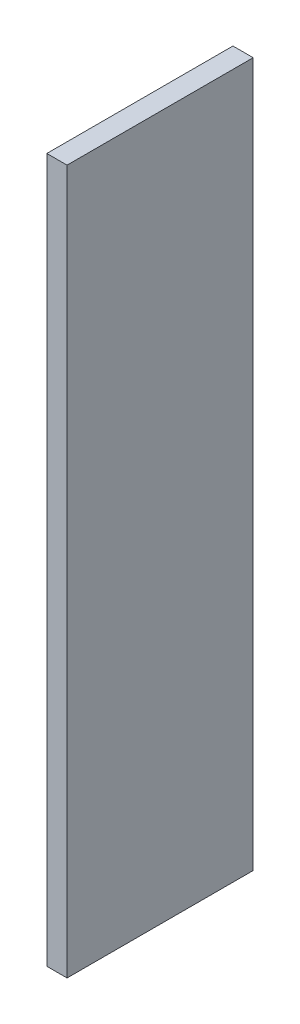
ISO-10303-21;
HEADER;
FILE_DESCRIPTION(('STEP AP214'),'2;1');
FILE_NAME('part.step','',(''),(''),'','','');
FILE_SCHEMA(('AUTOMOTIVE_DESIGN { 1 0 10303 214 1 1 1 1 }'));
ENDSEC;
DATA;
#1=APPLICATION_CONTEXT('core data for automotive mechanical design processes');
#2=APPLICATION_PROTOCOL_DEFINITION('international standard','automotive_design',2000,#1);
#3=PRODUCT_CONTEXT('',#1,'mechanical');
#4=PRODUCT('Part','Part','',(#3));
#5=PRODUCT_RELATED_PRODUCT_CATEGORY('part','',(#4));
#6=PRODUCT_DEFINITION_FORMATION('','',#4);
#7=PRODUCT_DEFINITION_CONTEXT('part definition',#1,'design');
#8=PRODUCT_DEFINITION('design','',#6,#7);
#9=PRODUCT_DEFINITION_SHAPE('','',#8);
#10=(LENGTH_UNIT() NAMED_UNIT(*) SI_UNIT(.MILLI.,.METRE.));
#11=(NAMED_UNIT(*) PLANE_ANGLE_UNIT() SI_UNIT($,.RADIAN.));
#12=(NAMED_UNIT(*) SI_UNIT($,.STERADIAN.) SOLID_ANGLE_UNIT());
#13=UNCERTAINTY_MEASURE_WITH_UNIT(LENGTH_MEASURE(1.E-05),#10,'distance_accuracy_value','');
#14=(GEOMETRIC_REPRESENTATION_CONTEXT(3) GLOBAL_UNCERTAINTY_ASSIGNED_CONTEXT((#13)) GLOBAL_UNIT_ASSIGNED_CONTEXT((#10,
#11,#12)) REPRESENTATION_CONTEXT('',''));
#15=CARTESIAN_POINT('',(0.,0.,0.));
#16=DIRECTION('',(0.,0.,1.));
#17=DIRECTION('',(1.,0.,0.));
#18=AXIS2_PLACEMENT_3D('',#15,#16,#17);
#19=CARTESIAN_POINT('',(1.17,0.832,-0.22));
#20=DIRECTION('',(0.,0.,1.));
#21=DIRECTION('',(0.,-1.,0.));
#22=AXIS2_PLACEMENT_3D('',#19,#20,#21);
#23=PLANE('',#22);
#24=DIRECTION('',(0.,-1.,0.));
#25=VECTOR('',#24,1.);
#26=CARTESIAN_POINT('',(1.22,0.,-0.22));
#27=LINE('',#26,#25);
#28=CARTESIAN_POINT('',(1.22,0.87,-0.22));
#29=VERTEX_POINT('',#28);
#30=CARTESIAN_POINT('',(1.22,-0.87,-0.22));
#31=VERTEX_POINT('',#30);
#32=EDGE_CURVE('E37',#29,#31,#27,.T.);
#33=ORIENTED_EDGE('',*,*,#32,.T.);
#34=DIRECTION('',(1.,0.,0.));
#35=VECTOR('',#34,1.);
#36=CARTESIAN_POINT('',(0.03,-0.87,-0.22));
#37=LINE('',#36,#35);
#38=CARTESIAN_POINT('',(1.17,-0.87,-0.22));
#39=VERTEX_POINT('',#38);
#40=EDGE_CURVE('E83',#39,#31,#37,.T.);
#41=ORIENTED_EDGE('',*,*,#40,.F.);
#42=DIRECTION('',(0.,-1.,0.));
#43=VECTOR('',#42,1.);
#44=CARTESIAN_POINT('',(1.17,0.832,-0.22));
#45=LINE('',#44,#43);
#46=CARTESIAN_POINT('',(1.17,0.87,-0.22));
#47=VERTEX_POINT('',#46);
#48=EDGE_CURVE('E11',#47,#39,#45,.T.);
#49=ORIENTED_EDGE('',*,*,#48,.F.);
#50=DIRECTION('',(-1.,0.,0.));
#51=VECTOR('',#50,1.);
#52=CARTESIAN_POINT('',(0.03,0.87,-0.22));
#53=LINE('',#52,#51);
#54=EDGE_CURVE('E85',#29,#47,#53,.T.);
#55=ORIENTED_EDGE('',*,*,#54,.F.);
#56=EDGE_LOOP('',(#33,#41,#49,#55));
#57=FACE_BOUND('',#56,.T.);
#58=ADVANCED_FACE('F33',(#57),#23,.F.);
#59=CARTESIAN_POINT('',(1.17,0.546,0.24));
#60=DIRECTION('',(-1.,0.,0.));
#61=DIRECTION('',(0.,0.,1.));
#62=AXIS2_PLACEMENT_3D('',#59,#60,#61);
#63=PLANE('',#62);
#64=DIRECTION('',(0.,1.,0.));
#65=VECTOR('',#64,1.);
#66=CARTESIAN_POINT('',(1.17,-0.746,0.24));
#67=LINE('',#66,#65);
#68=CARTESIAN_POINT('',(1.17,-0.87,0.24));
#69=VERTEX_POINT('',#68);
#70=CARTESIAN_POINT('',(1.17,0.87,0.24));
#71=VERTEX_POINT('',#70);
#72=EDGE_CURVE('E42',#69,#71,#67,.T.);
#73=ORIENTED_EDGE('',*,*,#72,.T.);
#74=DIRECTION('',(0.,0.,-1.));
#75=VECTOR('',#74,1.);
#76=CARTESIAN_POINT('',(1.17,0.87,0.22));
#77=LINE('',#76,#75);
#78=EDGE_CURVE('E79',#71,#47,#77,.T.);
#79=ORIENTED_EDGE('',*,*,#78,.T.);
#80=ORIENTED_EDGE('',*,*,#48,.T.);
#81=DIRECTION('',(0.,0.,-1.));
#82=VECTOR('',#81,1.);
#83=CARTESIAN_POINT('',(1.17,-0.87,1.41968162443208));
#84=LINE('',#83,#82);
#85=EDGE_CURVE('E77',#69,#39,#84,.T.);
#86=ORIENTED_EDGE('',*,*,#85,.F.);
#87=EDGE_LOOP('',(#73,#79,#80,#86));
#88=FACE_BOUND('',#87,.T.);
#89=ADVANCED_FACE('F75',(#88),#63,.T.);
#90=CARTESIAN_POINT('',(1.22,0.,0.));
#91=DIRECTION('',(1.,0.,0.));
#92=DIRECTION('',(0.,0.,-1.));
#93=AXIS2_PLACEMENT_3D('',#90,#91,#92);
#94=PLANE('',#93);
#95=ORIENTED_EDGE('',*,*,#32,.F.);
#96=DIRECTION('',(0.,0.,1.));
#97=VECTOR('',#96,1.);
#98=CARTESIAN_POINT('',(1.22,0.87,-0.22));
#99=LINE('',#98,#97);
#100=CARTESIAN_POINT('',(1.22,0.87,0.24));
#101=VERTEX_POINT('',#100);
#102=EDGE_CURVE('E90',#29,#101,#99,.T.);
#103=ORIENTED_EDGE('',*,*,#102,.T.);
#104=DIRECTION('',(0.,1.,0.));
#105=VECTOR('',#104,1.);
#106=CARTESIAN_POINT('',(1.22,-0.87,0.24));
#107=LINE('',#106,#105);
#108=CARTESIAN_POINT('',(1.22,-0.87,0.24));
#109=VERTEX_POINT('',#108);
#110=EDGE_CURVE('E92',#109,#101,#107,.T.);
#111=ORIENTED_EDGE('',*,*,#110,.F.);
#112=DIRECTION('',(0.,0.,-1.));
#113=VECTOR('',#112,1.);
#114=CARTESIAN_POINT('',(1.22,-0.87,0.22));
#115=LINE('',#114,#113);
#116=EDGE_CURVE('E57',#109,#31,#115,.T.);
#117=ORIENTED_EDGE('',*,*,#116,.T.);
#118=EDGE_LOOP('',(#95,#103,#111,#117));
#119=FACE_BOUND('',#118,.T.);
#120=ADVANCED_FACE('F106',(#119),#94,.T.);
#121=CARTESIAN_POINT('',(0.03,-0.87,0.22));
#122=DIRECTION('',(0.,1.,0.));
#123=DIRECTION('',(0.,0.,1.));
#124=AXIS2_PLACEMENT_3D('',#121,#122,#123);
#125=PLANE('',#124);
#126=ORIENTED_EDGE('',*,*,#85,.T.);
#127=ORIENTED_EDGE('',*,*,#40,.T.);
#128=ORIENTED_EDGE('',*,*,#116,.F.);
#129=DIRECTION('',(1.,0.,0.));
#130=VECTOR('',#129,1.);
#131=CARTESIAN_POINT('',(1.17,-0.87,0.24));
#132=LINE('',#131,#130);
#133=EDGE_CURVE('E88',#69,#109,#132,.T.);
#134=ORIENTED_EDGE('',*,*,#133,.F.);
#135=EDGE_LOOP('',(#126,#127,#128,#134));
#136=FACE_BOUND('',#135,.T.);
#137=ADVANCED_FACE('F87',(#136),#125,.F.);
#138=CARTESIAN_POINT('',(0.03,0.87,0.22));
#139=DIRECTION('',(0.,-1.,0.));
#140=DIRECTION('',(0.,0.,-1.));
#141=AXIS2_PLACEMENT_3D('',#138,#139,#140);
#142=PLANE('',#141);
#143=ORIENTED_EDGE('',*,*,#102,.F.);
#144=ORIENTED_EDGE('',*,*,#54,.T.);
#145=ORIENTED_EDGE('',*,*,#78,.F.);
#146=DIRECTION('',(-1.,0.,0.));
#147=VECTOR('',#146,1.);
#148=CARTESIAN_POINT('',(1.22,0.87,0.24));
#149=LINE('',#148,#147);
#150=EDGE_CURVE('E89',#101,#71,#149,.T.);
#151=ORIENTED_EDGE('',*,*,#150,.F.);
#152=EDGE_LOOP('',(#143,#144,#145,#151));
#153=FACE_BOUND('',#152,.T.);
#154=ADVANCED_FACE('F103',(#153),#142,.F.);
#155=CARTESIAN_POINT('',(0.,0.,0.24));
#156=DIRECTION('',(0.,0.,1.));
#157=DIRECTION('',(1.,0.,0.));
#158=AXIS2_PLACEMENT_3D('',#155,#156,#157);
#159=PLANE('',#158);
#160=ORIENTED_EDGE('',*,*,#150,.T.);
#161=ORIENTED_EDGE('',*,*,#72,.F.);
#162=ORIENTED_EDGE('',*,*,#133,.T.);
#163=ORIENTED_EDGE('',*,*,#110,.T.);
#164=EDGE_LOOP('',(#160,#161,#162,#163));
#165=FACE_BOUND('',#164,.T.);
#166=ADVANCED_FACE('F35',(#165),#159,.T.);
#167=CLOSED_SHELL('',(#58,#89,#120,#137,#154,#166));
#168=MANIFOLD_SOLID_BREP('B2',#167);
#169=ADVANCED_BREP_SHAPE_REPRESENTATION('',(#18,#168),#14);
#170=SHAPE_DEFINITION_REPRESENTATION(#9,#169);
ENDSEC;
END-ISO-10303-21;
